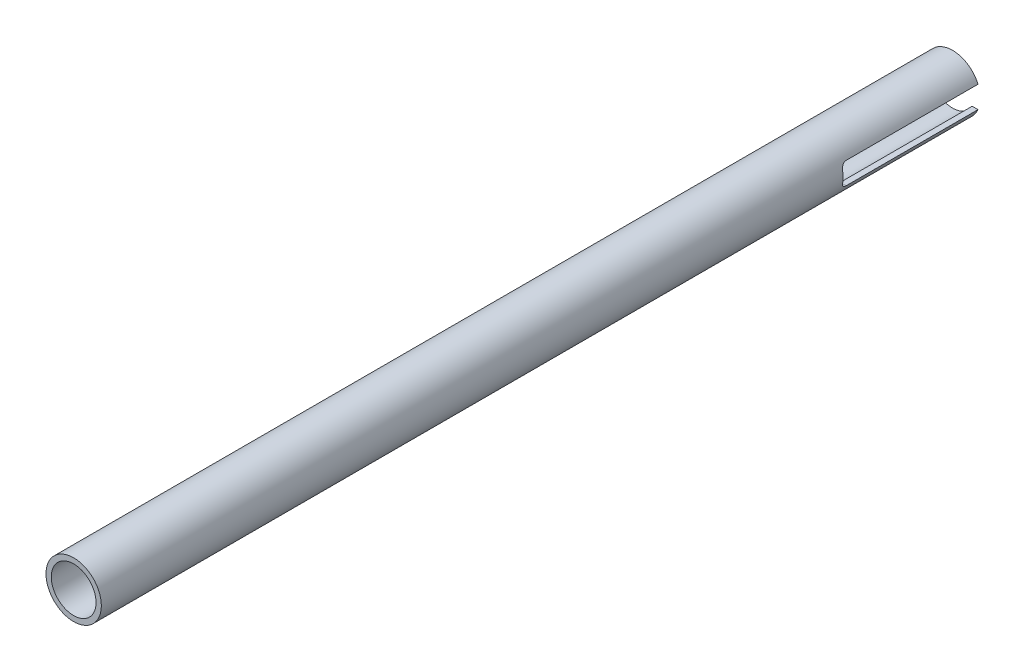
ISO-10303-21;
HEADER;
FILE_DESCRIPTION(('STEP AP214'),'2;1');
FILE_NAME('part.step','',(''),(''),'','','');
FILE_SCHEMA(('AUTOMOTIVE_DESIGN { 1 0 10303 214 1 1 1 1 }'));
ENDSEC;
DATA;
#1=APPLICATION_CONTEXT('core data for automotive mechanical design processes');
#2=APPLICATION_PROTOCOL_DEFINITION('international standard','automotive_design',2000,#1);
#3=PRODUCT_CONTEXT('',#1,'mechanical');
#4=PRODUCT('Part','Part','',(#3));
#5=PRODUCT_RELATED_PRODUCT_CATEGORY('part','',(#4));
#6=PRODUCT_DEFINITION_FORMATION('','',#4);
#7=PRODUCT_DEFINITION_CONTEXT('part definition',#1,'design');
#8=PRODUCT_DEFINITION('design','',#6,#7);
#9=PRODUCT_DEFINITION_SHAPE('','',#8);
#10=(LENGTH_UNIT() NAMED_UNIT(*) SI_UNIT(.MILLI.,.METRE.));
#11=(NAMED_UNIT(*) PLANE_ANGLE_UNIT() SI_UNIT($,.RADIAN.));
#12=(NAMED_UNIT(*) SI_UNIT($,.STERADIAN.) SOLID_ANGLE_UNIT());
#13=UNCERTAINTY_MEASURE_WITH_UNIT(LENGTH_MEASURE(1.E-05),#10,'distance_accuracy_value','');
#14=(GEOMETRIC_REPRESENTATION_CONTEXT(3) GLOBAL_UNCERTAINTY_ASSIGNED_CONTEXT((#13)) GLOBAL_UNIT_ASSIGNED_CONTEXT((#10,
#11,#12)) REPRESENTATION_CONTEXT('',''));
#15=CARTESIAN_POINT('',(0.,0.,0.));
#16=DIRECTION('',(0.,0.,1.));
#17=DIRECTION('',(1.,0.,0.));
#18=AXIS2_PLACEMENT_3D('',#15,#16,#17);
#19=CARTESIAN_POINT('',(0.,0.,0.));
#20=DIRECTION('',(0.,0.,1.));
#21=DIRECTION('',(1.,0.,0.));
#22=AXIS2_PLACEMENT_3D('',#19,#20,#21);
#23=PLANE('',#22);
#24=DIRECTION('',(-1.,0.,0.));
#25=VECTOR('',#24,1.);
#26=CARTESIAN_POINT('',(328.758916594076,-3.17500000000001,0.));
#27=LINE('',#26,#25);
#28=CARTESIAN_POINT('',(7.34407080575888,-3.17500000000001,0.));
#29=VERTEX_POINT('',#28);
#30=CARTESIAN_POINT('',(5.64543213580679,-3.175,0.));
#31=VERTEX_POINT('',#30);
#32=EDGE_CURVE('E64',#29,#31,#27,.T.);
#33=ORIENTED_EDGE('',*,*,#32,.F.);
#34=CARTESIAN_POINT('',(0.,0.,0.));
#35=DIRECTION('',(0.,0.,1.));
#36=DIRECTION('',(1.,0.,0.));
#37=AXIS2_PLACEMENT_3D('',#34,#35,#36);
#38=CIRCLE('',#37,8.001);
#39=CARTESIAN_POINT('',(-7.34407080575888,-3.17500000000001,0.));
#40=VERTEX_POINT('',#39);
#41=EDGE_CURVE('E155',#40,#29,#38,.T.);
#42=ORIENTED_EDGE('',*,*,#41,.F.);
#43=CARTESIAN_POINT('',(-5.64543213580682,-3.17500000000001,0.));
#44=VERTEX_POINT('',#43);
#45=EDGE_CURVE('E149',#44,#40,#27,.T.);
#46=ORIENTED_EDGE('',*,*,#45,.F.);
#47=CARTESIAN_POINT('',(0.,0.,0.));
#48=DIRECTION('',(0.,0.,1.));
#49=DIRECTION('',(1.,0.,0.));
#50=AXIS2_PLACEMENT_3D('',#47,#48,#49);
#51=CIRCLE('',#50,6.477);
#52=EDGE_CURVE('E260',#44,#31,#51,.T.);
#53=ORIENTED_EDGE('',*,*,#52,.T.);
#54=EDGE_LOOP('',(#33,#42,#46,#53));
#55=FACE_BOUND('',#54,.T.);
#56=ADVANCED_FACE('F39',(#55),#23,.F.);
#57=CARTESIAN_POINT('',(0.,0.,254.));
#58=DIRECTION('',(0.,0.,-1.));
#59=DIRECTION('',(-1.,0.,0.));
#60=AXIS2_PLACEMENT_3D('',#57,#58,#59);
#61=CYLINDRICAL_SURFACE('',#60,8.001);
#62=CARTESIAN_POINT('',(0.,0.,254.));
#63=DIRECTION('',(0.,0.,1.));
#64=DIRECTION('',(1.,0.,0.));
#65=AXIS2_PLACEMENT_3D('',#62,#63,#64);
#66=CIRCLE('',#65,8.001);
#67=CARTESIAN_POINT('',(8.001,0.,254.));
#68=VERTEX_POINT('',#67);
#69=EDGE_CURVE('E269',#68,#68,#66,.T.);
#70=ORIENTED_EDGE('',*,*,#69,.F.);
#71=EDGE_LOOP('',(#70));
#72=FACE_BOUND('',#71,.T.);
#73=DIRECTION('',(0.,0.,-1.));
#74=VECTOR('',#73,1.);
#75=CARTESIAN_POINT('',(7.3440708057589,3.17499999999997,254.));
#76=LINE('',#75,#74);
#77=CARTESIAN_POINT('',(7.34407080575888,3.175,0.));
#78=VERTEX_POINT('',#77);
#79=CARTESIAN_POINT('',(7.34407080575889,3.17499999999999,38.1));
#80=VERTEX_POINT('',#79);
#81=EDGE_CURVE('E254',#78,#80,#76,.F.);
#82=ORIENTED_EDGE('',*,*,#81,.F.);
#83=CARTESIAN_POINT('',(-7.34407080575888,3.175,0.));
#84=VERTEX_POINT('',#83);
#85=EDGE_CURVE('E274',#78,#84,#38,.T.);
#86=ORIENTED_EDGE('',*,*,#85,.T.);
#87=DIRECTION('',(0.,0.,-1.));
#88=VECTOR('',#87,1.);
#89=CARTESIAN_POINT('',(-7.3440708057589,3.17499999999997,254.));
#90=LINE('',#89,#88);
#91=CARTESIAN_POINT('',(-7.34407080575889,3.17499999999999,38.1));
#92=VERTEX_POINT('',#91);
#93=EDGE_CURVE('E257',#92,#84,#90,.T.);
#94=ORIENTED_EDGE('',*,*,#93,.F.);
#95=CARTESIAN_POINT('',(-7.8288057837706,1.65099999999999,39.624));
#96=CARTESIAN_POINT('',(-7.81947795268345,1.69524181564515,39.6239996807889));
#97=CARTESIAN_POINT('',(-7.80977555287386,1.73937906238704,39.6220725755956));
#98=CARTESIAN_POINT('',(-7.78970531909619,1.82715995012294,39.6144259194222));
#99=CARTESIAN_POINT('',(-7.77933765259943,1.87080371211601,39.6087073195399));
#100=CARTESIAN_POINT('',(-7.74740781787862,2.0003868914338,39.5859920832168));
#101=CARTESIAN_POINT('',(-7.72497172734663,2.08520038066885,39.5634353611242));
#102=CARTESIAN_POINT('',(-7.67879255624773,2.24931803273244,39.5043529357356));
#103=CARTESIAN_POINT('',(-7.65505009243317,2.32862475603219,39.467833776622));
#104=CARTESIAN_POINT('',(-7.60739952527334,2.47987144136615,39.3818403935313));
#105=CARTESIAN_POINT('',(-7.58349136309819,2.55180862700727,39.3323613118312));
#106=CARTESIAN_POINT('',(-7.53640113822511,2.68773877112479,39.2205553900397));
#107=CARTESIAN_POINT('',(-7.51324222932275,2.75155008701077,39.1579974672164));
#108=CARTESIAN_POINT('',(-7.46969556535498,2.86766507697725,39.0221080561482));
#109=CARTESIAN_POINT('',(-7.44930787514765,2.91996848174229,38.9487763158346));
#110=CARTESIAN_POINT('',(-7.41339882631975,3.00995182097469,38.795356056821));
#111=CARTESIAN_POINT('',(-7.39775949227146,3.04799299625044,38.715507568052));
#112=CARTESIAN_POINT('',(-7.37198636942665,3.10981595853761,38.5496963126839));
#113=CARTESIAN_POINT('',(-7.36184321814924,3.13362200161646,38.4637442276388));
#114=CARTESIAN_POINT('',(-7.35134082404798,3.15814271182934,38.330748149592));
#115=CARTESIAN_POINT('',(-7.34862226710174,3.16445643648463,38.2848527548858));
#116=CARTESIAN_POINT('',(-7.34498545577234,3.17288497032066,38.1926477775769));
#117=CARTESIAN_POINT('',(-7.34406565426136,3.1750033879475,38.1463385853611));
#118=CARTESIAN_POINT('',(-7.34407080575889,3.17499999999999,38.1));
#119=B_SPLINE_CURVE_WITH_KNOTS('',3,(#95,#96,#97,#98,#99,#100,#101,#102,#103,#104,#105,#106,
#107,#108,#109,#110,#111,#112,#113,#114,#115,#116,#117,#118),.UNSPECIFIED.,.F.,.F.,(4,2,2,2,2,2,
2,2,2,2,2,4),(0.,0.135553024626245,0.271072058592374,0.541437670457961,0.811676717226674,
1.08201720207601,1.35761362878683,1.63321650449497,1.90127196271359,2.16886935439238,
2.3078905012207,2.44679202186551),.UNSPECIFIED.);
#120=CARTESIAN_POINT('',(-7.8288057837706,1.65099999999999,39.624));
#121=VERTEX_POINT('',#120);
#122=EDGE_CURVE('E240',#121,#92,#119,.T.);
#123=ORIENTED_EDGE('',*,*,#122,.F.);
#124=CARTESIAN_POINT('',(0.,0.,39.624));
#125=DIRECTION('',(0.,0.,-1.));
#126=DIRECTION('',(-1.,0.,0.));
#127=AXIS2_PLACEMENT_3D('',#124,#125,#126);
#128=CIRCLE('',#127,8.001);
#129=CARTESIAN_POINT('',(-7.8288057837706,-1.65100000000001,39.624));
#130=VERTEX_POINT('',#129);
#131=EDGE_CURVE('E142',#130,#121,#128,.T.);
#132=ORIENTED_EDGE('',*,*,#131,.F.);
#133=CARTESIAN_POINT('',(-7.34407080575888,-3.175,38.1));
#134=CARTESIAN_POINT('',(-7.3440680096913,-3.17500157818638,38.1406984476088));
#135=CARTESIAN_POINT('',(-7.34477630214677,-3.17336860893187,38.1813759502433));
#136=CARTESIAN_POINT('',(-7.34758309143993,-3.16686635956913,38.262411407968));
#137=CARTESIAN_POINT('',(-7.34968118035477,-3.16199802907896,38.3027694533067));
#138=CARTESIAN_POINT('',(-7.35798857580184,-3.14264423927033,38.4226338560667));
#139=CARTESIAN_POINT('',(-7.36621159330718,-3.12340930879257,38.5012906881812));
#140=CARTESIAN_POINT('',(-7.38735918413182,-3.07305366060584,38.6538993996992));
#141=CARTESIAN_POINT('',(-7.40028060607282,-3.04194090905529,38.727854393813));
#142=CARTESIAN_POINT('',(-7.4298815779994,-2.96890708335138,38.8694453435949));
#143=CARTESIAN_POINT('',(-7.44656372650464,-2.92697853298673,38.9370768840646));
#144=CARTESIAN_POINT('',(-7.48338951433548,-2.83153727514407,39.0673193992745));
#145=CARTESIAN_POINT('',(-7.50365176960141,-2.77760154335605,39.1295861247467));
#146=CARTESIAN_POINT('',(-7.54586923311684,-2.66077336101833,39.2443978381578));
#147=CARTESIAN_POINT('',(-7.56782510086072,-2.59787741319581,39.2969390116058));
#148=CARTESIAN_POINT('',(-7.61377353576087,-2.46009532987571,39.39442490565));
#149=CARTESIAN_POINT('',(-7.63780327629239,-2.38468542927396,39.438613263246));
#150=CARTESIAN_POINT('',(-7.68517828309943,-2.22728162943213,39.5135295949975));
#151=CARTESIAN_POINT('',(-7.70852388215323,-2.14529100625114,39.5442642181982));
#152=CARTESIAN_POINT('',(-7.74866065435345,-1.99473307846588,39.5863269168587));
#153=CARTESIAN_POINT('',(-7.76579152458538,-1.9270088220366,39.6003889784846));
#154=CARTESIAN_POINT('',(-7.79853598216448,-1.78994063052703,39.6192336722557));
#155=CARTESIAN_POINT('',(-7.81414985826825,-1.7205970068191,39.6240180736839));
#156=CARTESIAN_POINT('',(-7.8288057837706,-1.65100000000001,39.624));
#157=B_SPLINE_CURVE_WITH_KNOTS('',3,(#133,#134,#135,#136,#137,#138,#139,#140,#141,#142,#143,
#144,#145,#146,#147,#148,#149,#150,#151,#152,#153,#154,#155,#156),.UNSPECIFIED.,.F.,.F.,(4,2,2,
2,2,2,2,2,2,2,2,4),(0.,0.122015614312954,0.243995431359561,0.486888996424005,0.729619944201775,
0.972519126749114,1.225937118326,1.47945429417213,1.75015649231414,2.02072475374975,
2.23388433321155,2.44700325838136),.UNSPECIFIED.);
#158=CARTESIAN_POINT('',(-7.34407080575888,-3.175,38.1));
#159=VERTEX_POINT('',#158);
#160=EDGE_CURVE('E143',#159,#130,#157,.T.);
#161=ORIENTED_EDGE('',*,*,#160,.F.);
#162=DIRECTION('',(0.,0.,-1.));
#163=VECTOR('',#162,1.);
#164=CARTESIAN_POINT('',(-7.34407080575889,-3.175,254.));
#165=LINE('',#164,#163);
#166=EDGE_CURVE('E157',#40,#159,#165,.F.);
#167=ORIENTED_EDGE('',*,*,#166,.F.);
#168=ORIENTED_EDGE('',*,*,#41,.T.);
#169=DIRECTION('',(0.,0.,-1.));
#170=VECTOR('',#169,1.);
#171=CARTESIAN_POINT('',(7.34407080575889,-3.175,254.));
#172=LINE('',#171,#170);
#173=CARTESIAN_POINT('',(7.34407080575888,-3.175,38.1));
#174=VERTEX_POINT('',#173);
#175=EDGE_CURVE('E146',#174,#29,#172,.T.);
#176=ORIENTED_EDGE('',*,*,#175,.F.);
#177=CARTESIAN_POINT('',(7.8288057837706,-1.65100000000001,39.624));
#178=CARTESIAN_POINT('',(7.81947795268344,-1.69524181564516,39.6239996807889));
#179=CARTESIAN_POINT('',(7.80977555287386,-1.73937906238705,39.6220725755956));
#180=CARTESIAN_POINT('',(7.78970531909619,-1.82715995012295,39.6144259194222));
#181=CARTESIAN_POINT('',(7.77933765259943,-1.87080371211602,39.6087073195399));
#182=CARTESIAN_POINT('',(7.74740781787862,-2.00038689143381,39.5859920832168));
#183=CARTESIAN_POINT('',(7.72497172734662,-2.08520038066886,39.5634353611242));
#184=CARTESIAN_POINT('',(7.67879255624773,-2.24931803273245,39.5043529357356));
#185=CARTESIAN_POINT('',(7.65505009243317,-2.3286247560322,39.467833776622));
#186=CARTESIAN_POINT('',(7.60739952527334,-2.47987144136616,39.3818403935313));
#187=CARTESIAN_POINT('',(7.58349136309819,-2.55180862700728,39.3323613118312));
#188=CARTESIAN_POINT('',(7.5364011382251,-2.6877387711248,39.2205553900397));
#189=CARTESIAN_POINT('',(7.51324222932275,-2.75155008701078,39.1579974672164));
#190=CARTESIAN_POINT('',(7.46969556535497,-2.86766507697726,39.0221080561482));
#191=CARTESIAN_POINT('',(7.44930787514765,-2.9199684817423,38.9487763158346));
#192=CARTESIAN_POINT('',(7.41339882631974,-3.00995182097471,38.795356056821));
#193=CARTESIAN_POINT('',(7.39775949227146,-3.04799299625045,38.715507568052));
#194=CARTESIAN_POINT('',(7.37198636942665,-3.10981595853763,38.5496963126839));
#195=CARTESIAN_POINT('',(7.36184321814923,-3.13362200161647,38.4637442276388));
#196=CARTESIAN_POINT('',(7.35134082404797,-3.15814271182935,38.330748149592));
#197=CARTESIAN_POINT('',(7.34862226710173,-3.16445643648464,38.2848527548858));
#198=CARTESIAN_POINT('',(7.34498545577233,-3.17288497032067,38.1926477775769));
#199=CARTESIAN_POINT('',(7.34406565426135,-3.17500338794751,38.1463385853611));
#200=CARTESIAN_POINT('',(7.34407080575888,-3.175,38.1));
#201=B_SPLINE_CURVE_WITH_KNOTS('',3,(#177,#178,#179,#180,#181,#182,#183,#184,#185,#186,#187,
#188,#189,#190,#191,#192,#193,#194,#195,#196,#197,#198,#199,#200),.UNSPECIFIED.,.F.,.F.,(4,2,2,
2,2,2,2,2,2,2,2,4),(0.,0.135553024626244,0.271072058592374,0.541437670457962,0.811676717226675,
1.08201720207601,1.35761362878683,1.63321650449498,1.90127196271359,2.16886935439238,
2.3078905012207,2.44679202186551),.UNSPECIFIED.);
#202=CARTESIAN_POINT('',(7.8288057837706,-1.65100000000001,39.624));
#203=VERTEX_POINT('',#202);
#204=EDGE_CURVE('E131',#203,#174,#201,.T.);
#205=ORIENTED_EDGE('',*,*,#204,.F.);
#206=CARTESIAN_POINT('',(7.8288057837706,1.65099999999999,39.624));
#207=VERTEX_POINT('',#206);
#208=EDGE_CURVE('E247',#207,#203,#128,.T.);
#209=ORIENTED_EDGE('',*,*,#208,.F.);
#210=CARTESIAN_POINT('',(7.34407080575889,3.17499999999999,38.1));
#211=CARTESIAN_POINT('',(7.3440680096913,3.17500157818637,38.1406984476088));
#212=CARTESIAN_POINT('',(7.34477630214678,3.17336860893186,38.1813759502433));
#213=CARTESIAN_POINT('',(7.34758309143993,3.16686635956912,38.262411407968));
#214=CARTESIAN_POINT('',(7.34968118035478,3.16199802907895,38.3027694533067));
#215=CARTESIAN_POINT('',(7.35798857580184,3.14264423927032,38.4226338560667));
#216=CARTESIAN_POINT('',(7.36621159330719,3.12340930879256,38.5012906881812));
#217=CARTESIAN_POINT('',(7.38735918413182,3.07305366060583,38.6538993996992));
#218=CARTESIAN_POINT('',(7.40028060607282,3.04194090905528,38.727854393813));
#219=CARTESIAN_POINT('',(7.4298815779994,2.96890708335137,38.8694453435949));
#220=CARTESIAN_POINT('',(7.44656372650465,2.92697853298672,38.9370768840646));
#221=CARTESIAN_POINT('',(7.48338951433548,2.83153727514406,39.0673193992745));
#222=CARTESIAN_POINT('',(7.50365176960141,2.77760154335604,39.1295861247467));
#223=CARTESIAN_POINT('',(7.54586923311685,2.66077336101832,39.2443978381578));
#224=CARTESIAN_POINT('',(7.56782510086072,2.5978774131958,39.2969390116058));
#225=CARTESIAN_POINT('',(7.61377353576087,2.4600953298757,39.39442490565));
#226=CARTESIAN_POINT('',(7.6378032762924,2.38468542927395,39.438613263246));
#227=CARTESIAN_POINT('',(7.68517828309944,2.22728162943211,39.5135295949975));
#228=CARTESIAN_POINT('',(7.70852388215323,2.14529100625113,39.5442642181982));
#229=CARTESIAN_POINT('',(7.74866065435345,1.99473307846587,39.5863269168587));
#230=CARTESIAN_POINT('',(7.76579152458538,1.92700882203659,39.6003889784846));
#231=CARTESIAN_POINT('',(7.79853598216448,1.78994063052702,39.6192336722557));
#232=CARTESIAN_POINT('',(7.81414985826825,1.72059700681909,39.6240180736839));
#233=CARTESIAN_POINT('',(7.8288057837706,1.651,39.624));
#234=B_SPLINE_CURVE_WITH_KNOTS('',3,(#210,#211,#212,#213,#214,#215,#216,#217,#218,#219,#220,
#221,#222,#223,#224,#225,#226,#227,#228,#229,#230,#231,#232,#233),.UNSPECIFIED.,.F.,.F.,(4,2,2,
2,2,2,2,2,2,2,2,4),(0.,0.122015614312954,0.243995431359561,0.486888996424005,0.729619944201775,
0.972519126749114,1.225937118326,1.47945429417213,1.75015649231414,2.02072475374975,
2.23388433321155,2.44700325838136),.UNSPECIFIED.);
#235=EDGE_CURVE('E246',#80,#207,#234,.T.);
#236=ORIENTED_EDGE('',*,*,#235,.F.);
#237=EDGE_LOOP('',(#82,#86,#94,#123,#132,#161,#167,#168,#176,#205,#209,#236));
#238=FACE_BOUND('',#237,.T.);
#239=ADVANCED_FACE('F41',(#72,#238),#61,.T.);
#240=CARTESIAN_POINT('',(0.,0.,254.));
#241=DIRECTION('',(0.,0.,-1.));
#242=DIRECTION('',(-1.,0.,0.));
#243=AXIS2_PLACEMENT_3D('',#240,#241,#242);
#244=CYLINDRICAL_SURFACE('',#243,6.477);
#245=CARTESIAN_POINT('',(0.,0.,254.));
#246=DIRECTION('',(0.,0.,1.));
#247=DIRECTION('',(1.,0.,0.));
#248=AXIS2_PLACEMENT_3D('',#245,#246,#247);
#249=CIRCLE('',#248,6.477);
#250=CARTESIAN_POINT('',(6.477,0.,254.));
#251=VERTEX_POINT('',#250);
#252=EDGE_CURVE('E261',#251,#251,#249,.T.);
#253=ORIENTED_EDGE('',*,*,#252,.T.);
#254=EDGE_LOOP('',(#253));
#255=FACE_BOUND('',#254,.T.);
#256=CARTESIAN_POINT('',(5.64543213580682,3.175,0.));
#257=VERTEX_POINT('',#256);
#258=CARTESIAN_POINT('',(-5.64543213580682,3.175,0.));
#259=VERTEX_POINT('',#258);
#260=EDGE_CURVE('E265',#257,#259,#51,.T.);
#261=ORIENTED_EDGE('',*,*,#260,.F.);
#262=DIRECTION('',(0.,0.,-1.));
#263=VECTOR('',#262,1.);
#264=CARTESIAN_POINT('',(5.6454321358068,3.17499999999997,254.));
#265=LINE('',#264,#263);
#266=CARTESIAN_POINT('',(5.64543213580679,3.17499999999999,38.1));
#267=VERTEX_POINT('',#266);
#268=EDGE_CURVE('E11',#257,#267,#265,.F.);
#269=ORIENTED_EDGE('',*,*,#268,.T.);
#270=CARTESIAN_POINT('',(5.64543213580679,3.17499999999999,38.1));
#271=CARTESIAN_POINT('',(5.64542798532432,3.17500253012491,38.1395022750384));
#272=CARTESIAN_POINT('',(5.64629676751123,3.17346305780188,38.1789831851797));
#273=CARTESIAN_POINT('',(5.64973489172762,3.16734010596934,38.257616333837));
#274=CARTESIAN_POINT('',(5.65230347216193,3.16275798971433,38.2967687115998));
#275=CARTESIAN_POINT('',(5.6624528235623,3.14457608288719,38.4129070155873));
#276=CARTESIAN_POINT('',(5.67247830845162,3.12653965087181,38.4890381879893));
#277=CARTESIAN_POINT('',(5.69814957474154,3.07950075965755,38.6366255007952));
#278=CARTESIAN_POINT('',(5.71378770060105,3.05051323473278,38.7080878532046));
#279=CARTESIAN_POINT('',(5.74949312759985,2.98267072120714,38.8450337996201));
#280=CARTESIAN_POINT('',(5.76956543427929,2.94380457356396,38.9105105176722));
#281=CARTESIAN_POINT('',(5.81427344287328,2.8545402048413,39.0383725064171));
#282=CARTESIAN_POINT('',(5.83912294015508,2.80355001313474,39.1002682413202));
#283=CARTESIAN_POINT('',(5.89090094280743,2.6930540046848,39.2149190340714));
#284=CARTESIAN_POINT('',(5.91783040535228,2.63354425646505,39.2676698468731));
#285=CARTESIAN_POINT('',(5.9754026920417,2.50037980782342,39.3683991647787));
#286=CARTESIAN_POINT('',(6.00613015030677,2.42589024924427,39.4152294493506));
#287=CARTESIAN_POINT('',(6.06685054178971,2.26977298542593,39.4954912659983));
#288=CARTESIAN_POINT('',(6.09684379767183,2.18814849062354,39.5289287868608));
#289=CARTESIAN_POINT('',(6.1506895426371,2.03135452128192,39.5777262918858));
#290=CARTESIAN_POINT('',(6.17481721444706,1.95685658409069,39.5949485076857));
#291=CARTESIAN_POINT('',(6.2208090046563,1.80539896583252,39.6181012531514));
#292=CARTESIAN_POINT('',(6.24267154884634,1.72843762073707,39.6240239790673));
#293=CARTESIAN_POINT('',(6.26304462701648,1.651,39.624));
#294=B_SPLINE_CURVE_WITH_KNOTS('',3,(#270,#271,#272,#273,#274,#275,#276,#277,#278,#279,#280,
#281,#282,#283,#284,#285,#286,#287,#288,#289,#290,#291,#292,#293),.UNSPECIFIED.,.F.,.F.,(4,2,2,
2,2,2,2,2,2,2,2,4),(0.,0.118426117882553,0.236799210795268,0.472172634307245,0.70722622525207,
0.942546525606797,1.19340365391802,1.44437691938387,1.72272641785954,2.00095130860679,
2.2406452178067,2.48050460661625),.UNSPECIFIED.);
#295=CARTESIAN_POINT('',(6.26304462701648,1.65099999999999,39.624));
#296=VERTEX_POINT('',#295);
#297=EDGE_CURVE('E49',#267,#296,#294,.T.);
#298=ORIENTED_EDGE('',*,*,#297,.T.);
#299=CARTESIAN_POINT('',(0.,0.,39.624));
#300=DIRECTION('',(0.,0.,-1.));
#301=DIRECTION('',(-1.,0.,0.));
#302=AXIS2_PLACEMENT_3D('',#299,#300,#301);
#303=CIRCLE('',#302,6.477);
#304=CARTESIAN_POINT('',(6.26304462701648,-1.65100000000001,39.624));
#305=VERTEX_POINT('',#304);
#306=EDGE_CURVE('E202',#296,#305,#303,.T.);
#307=ORIENTED_EDGE('',*,*,#306,.T.);
#308=CARTESIAN_POINT('',(6.26304462701648,-1.65100000000001,39.624));
#309=CARTESIAN_POINT('',(6.25119301356599,-1.69597019045451,39.6239996512926));
#310=CARTESIAN_POINT('',(6.23885805015263,-1.74078424361484,39.6220087653986));
#311=CARTESIAN_POINT('',(6.21333080831812,-1.82980515275706,39.614134138941));
#312=CARTESIAN_POINT('',(6.20013884930389,-1.87401222760585,39.6082518413062));
#313=CARTESIAN_POINT('',(6.15951133396886,-2.00506101361784,39.5849457970163));
#314=CARTESIAN_POINT('',(6.13094979172369,-2.09061085165535,39.5618617467996));
#315=CARTESIAN_POINT('',(6.07212151471614,-2.25578612168244,39.5016219603263));
#316=CARTESIAN_POINT('',(6.04185654214358,-2.33541748531392,39.4644805465843));
#317=CARTESIAN_POINT('',(5.98100165398782,-2.48713337520254,39.3771532445204));
#318=CARTESIAN_POINT('',(5.95041151302896,-2.55921223237762,39.3269576544588));
#319=CARTESIAN_POINT('',(5.88959770370069,-2.69629003214929,39.2127307014112));
#320=CARTESIAN_POINT('',(5.85942026108732,-2.76097278644596,39.1482938275107));
#321=CARTESIAN_POINT('',(5.80262181829033,-2.87843237174364,39.0079375307773));
#322=CARTESIAN_POINT('',(5.77600068690932,-2.93120964200445,38.9320185317567));
#323=CARTESIAN_POINT('',(5.72961508062245,-3.02084256755071,38.7738173863488));
#324=CARTESIAN_POINT('',(5.70961192114585,-3.05826802843451,38.6919300118511));
#325=CARTESIAN_POINT('',(5.67705818777086,-3.11828924116529,38.5215909438744));
#326=CARTESIAN_POINT('',(5.66448853762436,-3.14092296814996,38.4331567140417));
#327=CARTESIAN_POINT('',(5.65274801817815,-3.16196375608022,38.3030428647809));
#328=CARTESIAN_POINT('',(5.65001234622036,-3.16684526064363,38.2626313476031));
#329=CARTESIAN_POINT('',(5.64635324825543,-3.17336296637714,38.1814890576694));
#330=CARTESIAN_POINT('',(5.64542881846813,-3.17500096508517,38.140758474312));
#331=CARTESIAN_POINT('',(5.64543213580679,-3.175,38.1));
#332=B_SPLINE_CURVE_WITH_KNOTS('',3,(#308,#309,#310,#311,#312,#313,#314,#315,#316,#317,#318,
#319,#320,#321,#322,#323,#324,#325,#326,#327,#328,#329,#330,#331),.UNSPECIFIED.,.F.,.F.,(4,2,2,
2,2,2,2,2,2,2,2,4),(0.,0.13941997674178,0.278788285754549,0.556665652257204,0.834260658887698,
1.11206256399923,1.39912695233711,1.68618074753331,1.96132294859869,2.23575596690122,
2.35800176569004,2.4801797973654),.UNSPECIFIED.);
#333=CARTESIAN_POINT('',(5.64543213580682,-3.175,38.1));
#334=VERTEX_POINT('',#333);
#335=EDGE_CURVE('E195',#305,#334,#332,.T.);
#336=ORIENTED_EDGE('',*,*,#335,.T.);
#337=DIRECTION('',(0.,0.,-1.));
#338=VECTOR('',#337,1.);
#339=CARTESIAN_POINT('',(5.64543213580679,-3.175,254.));
#340=LINE('',#339,#338);
#341=EDGE_CURVE('E147',#334,#31,#340,.T.);
#342=ORIENTED_EDGE('',*,*,#341,.T.);
#343=ORIENTED_EDGE('',*,*,#52,.F.);
#344=DIRECTION('',(0.,0.,-1.));
#345=VECTOR('',#344,1.);
#346=CARTESIAN_POINT('',(-5.64543213580679,-3.175,254.));
#347=LINE('',#346,#345);
#348=CARTESIAN_POINT('',(-5.64543213580679,-3.175,38.1));
#349=VERTEX_POINT('',#348);
#350=EDGE_CURVE('E273',#44,#349,#347,.F.);
#351=ORIENTED_EDGE('',*,*,#350,.T.);
#352=CARTESIAN_POINT('',(-5.64543213580679,-3.175,38.1));
#353=CARTESIAN_POINT('',(-5.64542798532432,-3.17500253012492,38.1395022750384));
#354=CARTESIAN_POINT('',(-5.64629676751122,-3.17346305780189,38.1789831851797));
#355=CARTESIAN_POINT('',(-5.64973489172762,-3.16734010596935,38.257616333837));
#356=CARTESIAN_POINT('',(-5.65230347216192,-3.16275798971434,38.2967687115998));
#357=CARTESIAN_POINT('',(-5.6624528235623,-3.1445760828872,38.4129070155873));
#358=CARTESIAN_POINT('',(-5.67247830845161,-3.12653965087182,38.4890381879893));
#359=CARTESIAN_POINT('',(-5.69814957474154,-3.07950075965756,38.6366255007952));
#360=CARTESIAN_POINT('',(-5.71378770060104,-3.05051323473279,38.7080878532046));
#361=CARTESIAN_POINT('',(-5.74949312759985,-2.98267072120715,38.8450337996201));
#362=CARTESIAN_POINT('',(-5.76956543427929,-2.94380457356397,38.9105105176722));
#363=CARTESIAN_POINT('',(-5.81427344287327,-2.85454020484131,39.0383725064171));
#364=CARTESIAN_POINT('',(-5.83912294015508,-2.80355001313475,39.1002682413202));
#365=CARTESIAN_POINT('',(-5.89090094280742,-2.69305400468481,39.2149190340714));
#366=CARTESIAN_POINT('',(-5.91783040535227,-2.63354425646507,39.2676698468731));
#367=CARTESIAN_POINT('',(-5.97540269204169,-2.50037980782343,39.3683991647787));
#368=CARTESIAN_POINT('',(-6.00613015030677,-2.42589024924427,39.4152294493506));
#369=CARTESIAN_POINT('',(-6.0668505417897,-2.26977298542594,39.4954912659983));
#370=CARTESIAN_POINT('',(-6.09684379767182,-2.18814849062355,39.5289287868608));
#371=CARTESIAN_POINT('',(-6.1506895426371,-2.03135452128193,39.5777262918858));
#372=CARTESIAN_POINT('',(-6.17481721444705,-1.9568565840907,39.5949485076857));
#373=CARTESIAN_POINT('',(-6.22080900465629,-1.80539896583254,39.6181012531514));
#374=CARTESIAN_POINT('',(-6.24267154884634,-1.72843762073708,39.6240239790673));
#375=CARTESIAN_POINT('',(-6.26304462701648,-1.65100000000001,39.624));
#376=B_SPLINE_CURVE_WITH_KNOTS('',3,(#352,#353,#354,#355,#356,#357,#358,#359,#360,#361,#362,
#363,#364,#365,#366,#367,#368,#369,#370,#371,#372,#373,#374,#375),.UNSPECIFIED.,.F.,.F.,(4,2,2,
2,2,2,2,2,2,2,2,4),(0.,0.118426117882553,0.236799210795268,0.472172634307245,0.70722622525207,
0.942546525606798,1.19340365391802,1.44437691938387,1.72272641785954,2.00095130860679,
2.24064521780669,2.48050460661625),.UNSPECIFIED.);
#377=CARTESIAN_POINT('',(-6.26304462701648,-1.65100000000001,39.624));
#378=VERTEX_POINT('',#377);
#379=EDGE_CURVE('E185',#349,#378,#376,.T.);
#380=ORIENTED_EDGE('',*,*,#379,.T.);
#381=CARTESIAN_POINT('',(-6.26304462701648,1.65099999999999,39.624));
#382=VERTEX_POINT('',#381);
#383=EDGE_CURVE('E228',#378,#382,#303,.T.);
#384=ORIENTED_EDGE('',*,*,#383,.T.);
#385=CARTESIAN_POINT('',(-6.26304462701648,1.65099999999999,39.624));
#386=CARTESIAN_POINT('',(-6.25119301356599,1.6959701904545,39.6239996512926));
#387=CARTESIAN_POINT('',(-6.23885805015263,1.74078424361483,39.6220087653986));
#388=CARTESIAN_POINT('',(-6.21333080831813,1.82980515275705,39.614134138941));
#389=CARTESIAN_POINT('',(-6.20013884930389,1.87401222760584,39.6082518413062));
#390=CARTESIAN_POINT('',(-6.15951133396887,2.00506101361783,39.5849457970163));
#391=CARTESIAN_POINT('',(-6.13094979172369,2.09061085165534,39.5618617467996));
#392=CARTESIAN_POINT('',(-6.07212151471614,2.25578612168243,39.5016219603263));
#393=CARTESIAN_POINT('',(-6.04185654214358,2.33541748531391,39.4644805465843));
#394=CARTESIAN_POINT('',(-5.98100165398782,2.48713337520253,39.3771532445204));
#395=CARTESIAN_POINT('',(-5.95041151302897,2.55921223237761,39.3269576544588));
#396=CARTESIAN_POINT('',(-5.88959770370069,2.69629003214928,39.2127307014112));
#397=CARTESIAN_POINT('',(-5.85942026108732,2.76097278644594,39.1482938275107));
#398=CARTESIAN_POINT('',(-5.80262181829034,2.87843237174362,39.0079375307773));
#399=CARTESIAN_POINT('',(-5.77600068690932,2.93120964200444,38.9320185317567));
#400=CARTESIAN_POINT('',(-5.72961508062246,3.0208425675507,38.7738173863488));
#401=CARTESIAN_POINT('',(-5.70961192114586,3.0582680284345,38.6919300118511));
#402=CARTESIAN_POINT('',(-5.67705818777086,3.11828924116528,38.5215909438744));
#403=CARTESIAN_POINT('',(-5.66448853762436,3.14092296814995,38.4331567140417));
#404=CARTESIAN_POINT('',(-5.65274801817815,3.16196375608021,38.303042864781));
#405=CARTESIAN_POINT('',(-5.65001234622036,3.16684526064362,38.2626313476031));
#406=CARTESIAN_POINT('',(-5.64635324825543,3.17336296637713,38.1814890576694));
#407=CARTESIAN_POINT('',(-5.64542881846814,3.17500096508516,38.140758474312));
#408=CARTESIAN_POINT('',(-5.64543213580679,3.17499999999999,38.1));
#409=B_SPLINE_CURVE_WITH_KNOTS('',3,(#385,#386,#387,#388,#389,#390,#391,#392,#393,#394,#395,
#396,#397,#398,#399,#400,#401,#402,#403,#404,#405,#406,#407,#408),.UNSPECIFIED.,.F.,.F.,(4,2,2,
2,2,2,2,2,2,2,2,4),(0.,0.139419976741779,0.278788285754548,0.556665652257204,0.834260658887698,
1.11206256399923,1.3991269523371,1.68618074753331,1.96132294859869,2.23575596690122,
2.35800176569004,2.4801797973654),.UNSPECIFIED.);
#410=CARTESIAN_POINT('',(-5.64543213580679,3.17499999999999,38.1));
#411=VERTEX_POINT('',#410);
#412=EDGE_CURVE('E220',#382,#411,#409,.T.);
#413=ORIENTED_EDGE('',*,*,#412,.T.);
#414=DIRECTION('',(0.,0.,-1.));
#415=VECTOR('',#414,1.);
#416=CARTESIAN_POINT('',(-5.6454321358068,3.17499999999997,254.));
#417=LINE('',#416,#415);
#418=EDGE_CURVE('E227',#411,#259,#417,.T.);
#419=ORIENTED_EDGE('',*,*,#418,.T.);
#420=EDGE_LOOP('',(#261,#269,#298,#307,#336,#342,#343,#351,#380,#384,#413,#419));
#421=FACE_BOUND('',#420,.T.);
#422=ADVANCED_FACE('F208',(#255,#421),#244,.F.);
#423=CARTESIAN_POINT('',(0.,0.,254.));
#424=DIRECTION('',(0.,0.,1.));
#425=DIRECTION('',(1.,0.,0.));
#426=AXIS2_PLACEMENT_3D('',#423,#424,#425);
#427=PLANE('',#426);
#428=ORIENTED_EDGE('',*,*,#69,.T.);
#429=EDGE_LOOP('',(#428));
#430=FACE_BOUND('',#429,.T.);
#431=ORIENTED_EDGE('',*,*,#252,.F.);
#432=EDGE_LOOP('',(#431));
#433=FACE_BOUND('',#432,.T.);
#434=ADVANCED_FACE('F213',(#430,#433),#427,.T.);
#435=ORIENTED_EDGE('',*,*,#85,.F.);
#436=DIRECTION('',(-1.,0.,0.));
#437=VECTOR('',#436,1.);
#438=CARTESIAN_POINT('',(328.758916594076,3.175,0.));
#439=LINE('',#438,#437);
#440=EDGE_CURVE('E162',#78,#257,#439,.T.);
#441=ORIENTED_EDGE('',*,*,#440,.T.);
#442=ORIENTED_EDGE('',*,*,#260,.T.);
#443=EDGE_CURVE('E300',#259,#84,#439,.T.);
#444=ORIENTED_EDGE('',*,*,#443,.T.);
#445=EDGE_LOOP('',(#435,#441,#442,#444));
#446=FACE_BOUND('',#445,.T.);
#447=ADVANCED_FACE('F339',(#446),#23,.F.);
#448=CARTESIAN_POINT('',(328.758916594076,-3.17500000000001,38.1));
#449=DIRECTION('',(0.,1.,0.));
#450=DIRECTION('',(0.,0.,1.));
#451=AXIS2_PLACEMENT_3D('',#448,#449,#450);
#452=PLANE('',#451);
#453=ORIENTED_EDGE('',*,*,#45,.T.);
#454=ORIENTED_EDGE('',*,*,#166,.T.);
#455=DIRECTION('',(-1.,0.,0.));
#456=VECTOR('',#455,1.);
#457=CARTESIAN_POINT('',(328.758916594076,-3.175,38.1));
#458=LINE('',#457,#456);
#459=EDGE_CURVE('E56',#349,#159,#458,.T.);
#460=ORIENTED_EDGE('',*,*,#459,.F.);
#461=ORIENTED_EDGE('',*,*,#350,.F.);
#462=EDGE_LOOP('',(#453,#454,#460,#461));
#463=FACE_BOUND('',#462,.T.);
#464=ADVANCED_FACE('F352',(#463),#452,.T.);
#465=CARTESIAN_POINT('',(328.758916594076,-1.65100000000001,38.1));
#466=DIRECTION('',(-1.,0.,0.));
#467=DIRECTION('',(0.,0.,1.));
#468=AXIS2_PLACEMENT_3D('',#465,#466,#467);
#469=CYLINDRICAL_SURFACE('',#468,1.524);
#470=ORIENTED_EDGE('',*,*,#459,.T.);
#471=ORIENTED_EDGE('',*,*,#160,.T.);
#472=DIRECTION('',(-1.,0.,0.));
#473=VECTOR('',#472,1.);
#474=CARTESIAN_POINT('',(328.758916594076,-1.65100000000001,39.624));
#475=LINE('',#474,#473);
#476=EDGE_CURVE('E312',#378,#130,#475,.T.);
#477=ORIENTED_EDGE('',*,*,#476,.F.);
#478=ORIENTED_EDGE('',*,*,#379,.F.);
#479=EDGE_LOOP('',(#470,#471,#477,#478));
#480=FACE_BOUND('',#479,.T.);
#481=ADVANCED_FACE('F180',(#480),#469,.F.);
#482=CARTESIAN_POINT('',(328.758916594076,1.65099999999999,39.624));
#483=DIRECTION('',(0.,0.,-1.));
#484=DIRECTION('',(-1.,0.,0.));
#485=AXIS2_PLACEMENT_3D('',#482,#483,#484);
#486=PLANE('',#485);
#487=ORIENTED_EDGE('',*,*,#476,.T.);
#488=ORIENTED_EDGE('',*,*,#131,.T.);
#489=DIRECTION('',(-1.,0.,0.));
#490=VECTOR('',#489,1.);
#491=CARTESIAN_POINT('',(328.758916594076,1.65099999999999,39.624));
#492=LINE('',#491,#490);
#493=EDGE_CURVE('E308',#382,#121,#492,.T.);
#494=ORIENTED_EDGE('',*,*,#493,.F.);
#495=ORIENTED_EDGE('',*,*,#383,.F.);
#496=EDGE_LOOP('',(#487,#488,#494,#495));
#497=FACE_BOUND('',#496,.T.);
#498=ADVANCED_FACE('F328',(#497),#486,.T.);
#499=CARTESIAN_POINT('',(328.758916594076,1.65099999999999,38.1));
#500=DIRECTION('',(-1.,0.,0.));
#501=DIRECTION('',(0.,0.,1.));
#502=AXIS2_PLACEMENT_3D('',#499,#500,#501);
#503=CYLINDRICAL_SURFACE('',#502,1.524);
#504=ORIENTED_EDGE('',*,*,#493,.T.);
#505=ORIENTED_EDGE('',*,*,#122,.T.);
#506=DIRECTION('',(-1.,0.,0.));
#507=VECTOR('',#506,1.);
#508=CARTESIAN_POINT('',(328.758916594076,3.17499999999999,38.1));
#509=LINE('',#508,#507);
#510=EDGE_CURVE('E301',#411,#92,#509,.T.);
#511=ORIENTED_EDGE('',*,*,#510,.F.);
#512=ORIENTED_EDGE('',*,*,#412,.F.);
#513=EDGE_LOOP('',(#504,#505,#511,#512));
#514=FACE_BOUND('',#513,.T.);
#515=ADVANCED_FACE('F234',(#514),#503,.F.);
#516=CARTESIAN_POINT('',(328.758916594076,3.175,0.));
#517=DIRECTION('',(0.,-1.,0.));
#518=DIRECTION('',(0.,0.,-1.));
#519=AXIS2_PLACEMENT_3D('',#516,#517,#518);
#520=PLANE('',#519);
#521=ORIENTED_EDGE('',*,*,#510,.T.);
#522=ORIENTED_EDGE('',*,*,#93,.T.);
#523=ORIENTED_EDGE('',*,*,#443,.F.);
#524=ORIENTED_EDGE('',*,*,#418,.F.);
#525=EDGE_LOOP('',(#521,#522,#523,#524));
#526=FACE_BOUND('',#525,.T.);
#527=ADVANCED_FACE('F215',(#526),#520,.T.);
#528=ORIENTED_EDGE('',*,*,#440,.F.);
#529=ORIENTED_EDGE('',*,*,#81,.T.);
#530=EDGE_CURVE('E293',#80,#267,#509,.T.);
#531=ORIENTED_EDGE('',*,*,#530,.T.);
#532=ORIENTED_EDGE('',*,*,#268,.F.);
#533=EDGE_LOOP('',(#528,#529,#531,#532));
#534=FACE_BOUND('',#533,.T.);
#535=ADVANCED_FACE('F232',(#534),#520,.T.);
#536=ORIENTED_EDGE('',*,*,#530,.F.);
#537=ORIENTED_EDGE('',*,*,#235,.T.);
#538=EDGE_CURVE('E296',#207,#296,#492,.T.);
#539=ORIENTED_EDGE('',*,*,#538,.T.);
#540=ORIENTED_EDGE('',*,*,#297,.F.);
#541=EDGE_LOOP('',(#536,#537,#539,#540));
#542=FACE_BOUND('',#541,.T.);
#543=ADVANCED_FACE('F229',(#542),#503,.F.);
#544=ORIENTED_EDGE('',*,*,#538,.F.);
#545=ORIENTED_EDGE('',*,*,#208,.T.);
#546=EDGE_CURVE('E137',#203,#305,#475,.T.);
#547=ORIENTED_EDGE('',*,*,#546,.T.);
#548=ORIENTED_EDGE('',*,*,#306,.F.);
#549=EDGE_LOOP('',(#544,#545,#547,#548));
#550=FACE_BOUND('',#549,.T.);
#551=ADVANCED_FACE('F179',(#550),#486,.T.);
#552=ORIENTED_EDGE('',*,*,#546,.F.);
#553=ORIENTED_EDGE('',*,*,#204,.T.);
#554=EDGE_CURVE('E134',#174,#334,#458,.T.);
#555=ORIENTED_EDGE('',*,*,#554,.T.);
#556=ORIENTED_EDGE('',*,*,#335,.F.);
#557=EDGE_LOOP('',(#552,#553,#555,#556));
#558=FACE_BOUND('',#557,.T.);
#559=ADVANCED_FACE('F133',(#558),#469,.F.);
#560=ORIENTED_EDGE('',*,*,#554,.F.);
#561=ORIENTED_EDGE('',*,*,#175,.T.);
#562=ORIENTED_EDGE('',*,*,#32,.T.);
#563=ORIENTED_EDGE('',*,*,#341,.F.);
#564=EDGE_LOOP('',(#560,#561,#562,#563));
#565=FACE_BOUND('',#564,.T.);
#566=ADVANCED_FACE('F145',(#565),#452,.T.);
#567=CLOSED_SHELL('',(#56,#239,#422,#434,#447,#464,#481,#498,#515,#527,#535,#543,#551,#559,#566));
#568=MANIFOLD_SOLID_BREP('B2',#567);
#569=ADVANCED_BREP_SHAPE_REPRESENTATION('',(#18,#568),#14);
#570=SHAPE_DEFINITION_REPRESENTATION(#9,#569);
ENDSEC;
END-ISO-10303-21;
